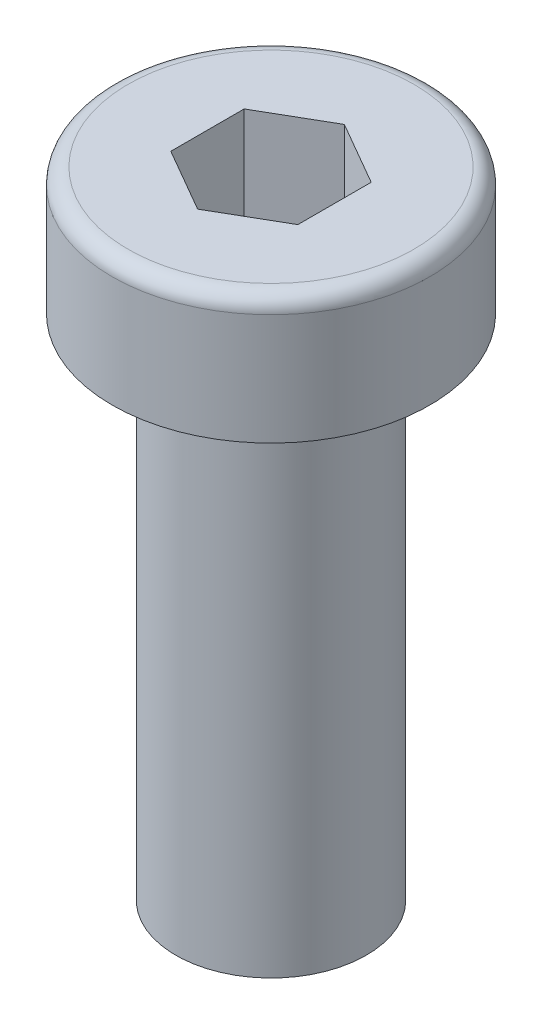
ISO-10303-21;
HEADER;
FILE_DESCRIPTION(('STEP AP214'),'2;1');
FILE_NAME('part.step','',(''),(''),'','','');
FILE_SCHEMA(('AUTOMOTIVE_DESIGN { 1 0 10303 214 1 1 1 1 }'));
ENDSEC;
DATA;
#1=APPLICATION_CONTEXT('core data for automotive mechanical design processes');
#2=APPLICATION_PROTOCOL_DEFINITION('international standard','automotive_design',2000,#1);
#3=PRODUCT_CONTEXT('',#1,'mechanical');
#4=PRODUCT('Part','Part','',(#3));
#5=PRODUCT_RELATED_PRODUCT_CATEGORY('part','',(#4));
#6=PRODUCT_DEFINITION_FORMATION('','',#4);
#7=PRODUCT_DEFINITION_CONTEXT('part definition',#1,'design');
#8=PRODUCT_DEFINITION('design','',#6,#7);
#9=PRODUCT_DEFINITION_SHAPE('','',#8);
#10=(LENGTH_UNIT() NAMED_UNIT(*) SI_UNIT(.MILLI.,.METRE.));
#11=(NAMED_UNIT(*) PLANE_ANGLE_UNIT() SI_UNIT($,.RADIAN.));
#12=(NAMED_UNIT(*) SI_UNIT($,.STERADIAN.) SOLID_ANGLE_UNIT());
#13=UNCERTAINTY_MEASURE_WITH_UNIT(LENGTH_MEASURE(1.E-05),#10,'distance_accuracy_value','');
#14=(GEOMETRIC_REPRESENTATION_CONTEXT(3) GLOBAL_UNCERTAINTY_ASSIGNED_CONTEXT((#13)) GLOBAL_UNIT_ASSIGNED_CONTEXT((#10,
#11,#12)) REPRESENTATION_CONTEXT('',''));
#15=CARTESIAN_POINT('',(0.,0.,0.));
#16=DIRECTION('',(0.,0.,1.));
#17=DIRECTION('',(1.,0.,0.));
#18=AXIS2_PLACEMENT_3D('',#15,#16,#17);
#19=CARTESIAN_POINT('',(0.,20.,0.));
#20=DIRECTION('',(0.,-1.,0.));
#21=DIRECTION('',(0.,0.,-1.));
#22=AXIS2_PLACEMENT_3D('',#19,#20,#21);
#23=PLANE('',#22);
#24=DIRECTION('',(-0.866025403784439,0.,0.5));
#25=VECTOR('',#24,1.);
#26=CARTESIAN_POINT('',(0.,20.,-2.3094010767585));
#27=LINE('',#26,#25);
#28=CARTESIAN_POINT('',(0.,20.,-2.3094010767585));
#29=VERTEX_POINT('',#28);
#30=CARTESIAN_POINT('',(-2.,20.,-1.15470053837925));
#31=VERTEX_POINT('',#30);
#32=EDGE_CURVE('E125',#29,#31,#27,.T.);
#33=ORIENTED_EDGE('',*,*,#32,.F.);
#34=DIRECTION('',(-0.866025403784439,0.,-0.5));
#35=VECTOR('',#34,1.);
#36=CARTESIAN_POINT('',(2.,20.,-1.15470053837925));
#37=LINE('',#36,#35);
#38=CARTESIAN_POINT('',(2.,20.,-1.15470053837925));
#39=VERTEX_POINT('',#38);
#40=EDGE_CURVE('E51',#39,#29,#37,.T.);
#41=ORIENTED_EDGE('',*,*,#40,.F.);
#42=DIRECTION('',(0.,0.,-1.));
#43=VECTOR('',#42,1.);
#44=CARTESIAN_POINT('',(2.,20.,1.15470053837925));
#45=LINE('',#44,#43);
#46=CARTESIAN_POINT('',(2.,20.,1.15470053837925));
#47=VERTEX_POINT('',#46);
#48=EDGE_CURVE('E134',#47,#39,#45,.T.);
#49=ORIENTED_EDGE('',*,*,#48,.F.);
#50=DIRECTION('',(0.866025403784439,0.,-0.5));
#51=VECTOR('',#50,1.);
#52=CARTESIAN_POINT('',(0.,20.,2.3094010767585));
#53=LINE('',#52,#51);
#54=CARTESIAN_POINT('',(0.,20.,2.3094010767585));
#55=VERTEX_POINT('',#54);
#56=EDGE_CURVE('E132',#55,#47,#53,.T.);
#57=ORIENTED_EDGE('',*,*,#56,.F.);
#58=DIRECTION('',(0.866025403784439,0.,0.5));
#59=VECTOR('',#58,1.);
#60=CARTESIAN_POINT('',(-2.,20.,1.15470053837925));
#61=LINE('',#60,#59);
#62=CARTESIAN_POINT('',(-2.,20.,1.15470053837925));
#63=VERTEX_POINT('',#62);
#64=EDGE_CURVE('E99',#63,#55,#61,.T.);
#65=ORIENTED_EDGE('',*,*,#64,.F.);
#66=DIRECTION('',(0.,0.,1.));
#67=VECTOR('',#66,1.);
#68=CARTESIAN_POINT('',(-2.,20.,-1.15470053837925));
#69=LINE('',#68,#67);
#70=EDGE_CURVE('E128',#31,#63,#69,.T.);
#71=ORIENTED_EDGE('',*,*,#70,.F.);
#72=EDGE_LOOP('',(#33,#41,#49,#57,#65,#71));
#73=FACE_BOUND('',#72,.T.);
#74=CARTESIAN_POINT('',(0.,20.,0.));
#75=DIRECTION('',(0.,-1.,0.));
#76=DIRECTION('',(0.,0.,-1.));
#77=AXIS2_PLACEMENT_3D('',#74,#75,#76);
#78=CIRCLE('',#77,4.5);
#79=CARTESIAN_POINT('',(0.,20.,-4.5));
#80=VERTEX_POINT('',#79);
#81=EDGE_CURVE('E11',#80,#80,#78,.T.);
#82=ORIENTED_EDGE('',*,*,#81,.F.);
#83=EDGE_LOOP('',(#82));
#84=FACE_BOUND('',#83,.T.);
#85=ADVANCED_FACE('F37',(#73,#84),#23,.F.);
#86=CARTESIAN_POINT('',(0.,19.5,0.));
#87=DIRECTION('',(0.,-1.,0.));
#88=DIRECTION('',(0.,0.,-1.));
#89=AXIS2_PLACEMENT_3D('',#86,#87,#88);
#90=TOROIDAL_SURFACE('',#89,4.5,0.499999999999998);
#91=CARTESIAN_POINT('',(0.,19.5,0.));
#92=DIRECTION('',(0.,-1.,0.));
#93=DIRECTION('',(0.,0.,-1.));
#94=AXIS2_PLACEMENT_3D('',#91,#92,#93);
#95=CIRCLE('',#94,5.);
#96=CARTESIAN_POINT('',(0.,19.5,-5.));
#97=VERTEX_POINT('',#96);
#98=EDGE_CURVE('E44',#97,#97,#95,.T.);
#99=ORIENTED_EDGE('',*,*,#98,.F.);
#100=EDGE_LOOP('',(#99));
#101=FACE_BOUND('',#100,.T.);
#102=ORIENTED_EDGE('',*,*,#81,.T.);
#103=EDGE_LOOP('',(#102));
#104=FACE_BOUND('',#103,.T.);
#105=ADVANCED_FACE('F156',(#101,#104),#90,.T.);
#106=CARTESIAN_POINT('',(0.,0.,0.));
#107=DIRECTION('',(0.,-1.,0.));
#108=DIRECTION('',(0.,0.,-1.));
#109=AXIS2_PLACEMENT_3D('',#106,#107,#108);
#110=CYLINDRICAL_SURFACE('',#109,5.);
#111=CARTESIAN_POINT('',(0.,16.,0.));
#112=DIRECTION('',(0.,-1.,0.));
#113=DIRECTION('',(0.,0.,-1.));
#114=AXIS2_PLACEMENT_3D('',#111,#112,#113);
#115=CIRCLE('',#114,5.);
#116=CARTESIAN_POINT('',(0.,16.,-5.));
#117=VERTEX_POINT('',#116);
#118=EDGE_CURVE('E149',#117,#117,#115,.T.);
#119=ORIENTED_EDGE('',*,*,#118,.F.);
#120=EDGE_LOOP('',(#119));
#121=FACE_BOUND('',#120,.T.);
#122=ORIENTED_EDGE('',*,*,#98,.T.);
#123=EDGE_LOOP('',(#122));
#124=FACE_BOUND('',#123,.T.);
#125=ADVANCED_FACE('F154',(#121,#124),#110,.T.);
#126=CARTESIAN_POINT('',(-5.,16.,0.));
#127=DIRECTION('',(0.,1.,0.));
#128=DIRECTION('',(0.,0.,1.));
#129=AXIS2_PLACEMENT_3D('',#126,#127,#128);
#130=PLANE('',#129);
#131=CARTESIAN_POINT('',(0.,16.,0.));
#132=DIRECTION('',(0.,-1.,0.));
#133=DIRECTION('',(0.,0.,-1.));
#134=AXIS2_PLACEMENT_3D('',#131,#132,#133);
#135=CIRCLE('',#134,3.);
#136=CARTESIAN_POINT('',(0.,16.,-3.));
#137=VERTEX_POINT('',#136);
#138=EDGE_CURVE('E146',#137,#137,#135,.T.);
#139=ORIENTED_EDGE('',*,*,#138,.F.);
#140=EDGE_LOOP('',(#139));
#141=FACE_BOUND('',#140,.T.);
#142=ORIENTED_EDGE('',*,*,#118,.T.);
#143=EDGE_LOOP('',(#142));
#144=FACE_BOUND('',#143,.T.);
#145=ADVANCED_FACE('F189',(#141,#144),#130,.F.);
#146=CARTESIAN_POINT('',(0.,0.,0.));
#147=DIRECTION('',(0.,-1.,0.));
#148=DIRECTION('',(0.,0.,-1.));
#149=AXIS2_PLACEMENT_3D('',#146,#147,#148);
#150=CYLINDRICAL_SURFACE('',#149,3.);
#151=CARTESIAN_POINT('',(0.,0.,0.));
#152=DIRECTION('',(0.,-1.,0.));
#153=DIRECTION('',(0.,0.,-1.));
#154=AXIS2_PLACEMENT_3D('',#151,#152,#153);
#155=CIRCLE('',#154,3.);
#156=CARTESIAN_POINT('',(0.,0.,-3.));
#157=VERTEX_POINT('',#156);
#158=EDGE_CURVE('E138',#157,#157,#155,.T.);
#159=ORIENTED_EDGE('',*,*,#158,.F.);
#160=EDGE_LOOP('',(#159));
#161=FACE_BOUND('',#160,.T.);
#162=ORIENTED_EDGE('',*,*,#138,.T.);
#163=EDGE_LOOP('',(#162));
#164=FACE_BOUND('',#163,.T.);
#165=ADVANCED_FACE('F181',(#161,#164),#150,.T.);
#166=CARTESIAN_POINT('',(-3.,0.,0.));
#167=DIRECTION('',(0.,1.,0.));
#168=DIRECTION('',(0.,0.,1.));
#169=AXIS2_PLACEMENT_3D('',#166,#167,#168);
#170=PLANE('',#169);
#171=ORIENTED_EDGE('',*,*,#158,.T.);
#172=EDGE_LOOP('',(#171));
#173=FACE_BOUND('',#172,.T.);
#174=ADVANCED_FACE('F175',(#173),#170,.F.);
#175=CARTESIAN_POINT('',(2.,17.,-1.15470053837925));
#176=DIRECTION('',(0.5,0.,-0.866025403784439));
#177=DIRECTION('',(-0.866025403784439,0.,-0.5));
#178=AXIS2_PLACEMENT_3D('',#175,#176,#177);
#179=PLANE('',#178);
#180=ORIENTED_EDGE('',*,*,#40,.T.);
#181=DIRECTION('',(0.,1.,0.));
#182=VECTOR('',#181,1.);
#183=CARTESIAN_POINT('',(0.,17.,-2.3094010767585));
#184=LINE('',#183,#182);
#185=CARTESIAN_POINT('',(0.,17.,-2.3094010767585));
#186=VERTEX_POINT('',#185);
#187=EDGE_CURVE('E81',#186,#29,#184,.T.);
#188=ORIENTED_EDGE('',*,*,#187,.F.);
#189=DIRECTION('',(-0.866025403784439,0.,-0.5));
#190=VECTOR('',#189,1.);
#191=CARTESIAN_POINT('',(2.,17.,-1.15470053837925));
#192=LINE('',#191,#190);
#193=CARTESIAN_POINT('',(2.,17.,-1.15470053837925));
#194=VERTEX_POINT('',#193);
#195=EDGE_CURVE('E136',#194,#186,#192,.T.);
#196=ORIENTED_EDGE('',*,*,#195,.F.);
#197=DIRECTION('',(0.,1.,0.));
#198=VECTOR('',#197,1.);
#199=CARTESIAN_POINT('',(2.,17.,-1.15470053837925));
#200=LINE('',#199,#198);
#201=EDGE_CURVE('E59',#194,#39,#200,.T.);
#202=ORIENTED_EDGE('',*,*,#201,.T.);
#203=EDGE_LOOP('',(#180,#188,#196,#202));
#204=FACE_BOUND('',#203,.T.);
#205=ADVANCED_FACE('F173',(#204),#179,.F.);
#206=CARTESIAN_POINT('',(2.,17.,1.15470053837925));
#207=DIRECTION('',(1.,0.,0.));
#208=DIRECTION('',(0.,0.,-1.));
#209=AXIS2_PLACEMENT_3D('',#206,#207,#208);
#210=PLANE('',#209);
#211=ORIENTED_EDGE('',*,*,#48,.T.);
#212=ORIENTED_EDGE('',*,*,#201,.F.);
#213=DIRECTION('',(0.,0.,-1.));
#214=VECTOR('',#213,1.);
#215=CARTESIAN_POINT('',(2.,17.,1.15470053837925));
#216=LINE('',#215,#214);
#217=CARTESIAN_POINT('',(2.,17.,1.15470053837925));
#218=VERTEX_POINT('',#217);
#219=EDGE_CURVE('E111',#218,#194,#216,.T.);
#220=ORIENTED_EDGE('',*,*,#219,.F.);
#221=DIRECTION('',(0.,1.,0.));
#222=VECTOR('',#221,1.);
#223=CARTESIAN_POINT('',(2.,17.,1.15470053837925));
#224=LINE('',#223,#222);
#225=EDGE_CURVE('E103',#218,#47,#224,.T.);
#226=ORIENTED_EDGE('',*,*,#225,.T.);
#227=EDGE_LOOP('',(#211,#212,#220,#226));
#228=FACE_BOUND('',#227,.T.);
#229=ADVANCED_FACE('F174',(#228),#210,.F.);
#230=CARTESIAN_POINT('',(0.,17.,2.3094010767585));
#231=DIRECTION('',(0.5,0.,0.866025403784439));
#232=DIRECTION('',(0.866025403784439,0.,-0.5));
#233=AXIS2_PLACEMENT_3D('',#230,#231,#232);
#234=PLANE('',#233);
#235=ORIENTED_EDGE('',*,*,#56,.T.);
#236=ORIENTED_EDGE('',*,*,#225,.F.);
#237=DIRECTION('',(0.866025403784439,0.,-0.5));
#238=VECTOR('',#237,1.);
#239=CARTESIAN_POINT('',(0.,17.,2.3094010767585));
#240=LINE('',#239,#238);
#241=CARTESIAN_POINT('',(0.,17.,2.3094010767585));
#242=VERTEX_POINT('',#241);
#243=EDGE_CURVE('E107',#242,#218,#240,.T.);
#244=ORIENTED_EDGE('',*,*,#243,.F.);
#245=DIRECTION('',(0.,1.,0.));
#246=VECTOR('',#245,1.);
#247=CARTESIAN_POINT('',(0.,17.,2.3094010767585));
#248=LINE('',#247,#246);
#249=EDGE_CURVE('E92',#242,#55,#248,.T.);
#250=ORIENTED_EDGE('',*,*,#249,.T.);
#251=EDGE_LOOP('',(#235,#236,#244,#250));
#252=FACE_BOUND('',#251,.T.);
#253=ADVANCED_FACE('F108',(#252),#234,.F.);
#254=CARTESIAN_POINT('',(-2.,17.,1.15470053837925));
#255=DIRECTION('',(-0.5,0.,0.866025403784438));
#256=DIRECTION('',(0.866025403784439,0.,0.5));
#257=AXIS2_PLACEMENT_3D('',#254,#255,#256);
#258=PLANE('',#257);
#259=ORIENTED_EDGE('',*,*,#64,.T.);
#260=ORIENTED_EDGE('',*,*,#249,.F.);
#261=DIRECTION('',(0.866025403784439,0.,0.5));
#262=VECTOR('',#261,1.);
#263=CARTESIAN_POINT('',(-2.,17.,1.15470053837925));
#264=LINE('',#263,#262);
#265=CARTESIAN_POINT('',(-2.,17.,1.15470053837925));
#266=VERTEX_POINT('',#265);
#267=EDGE_CURVE('E96',#266,#242,#264,.T.);
#268=ORIENTED_EDGE('',*,*,#267,.F.);
#269=DIRECTION('',(0.,1.,0.));
#270=VECTOR('',#269,1.);
#271=CARTESIAN_POINT('',(-2.,17.,1.15470053837925));
#272=LINE('',#271,#270);
#273=EDGE_CURVE('E104',#266,#63,#272,.T.);
#274=ORIENTED_EDGE('',*,*,#273,.T.);
#275=EDGE_LOOP('',(#259,#260,#268,#274));
#276=FACE_BOUND('',#275,.T.);
#277=ADVANCED_FACE('F94',(#276),#258,.F.);
#278=CARTESIAN_POINT('',(-2.,17.,-1.15470053837925));
#279=DIRECTION('',(-1.,0.,0.));
#280=DIRECTION('',(0.,0.,1.));
#281=AXIS2_PLACEMENT_3D('',#278,#279,#280);
#282=PLANE('',#281);
#283=ORIENTED_EDGE('',*,*,#70,.T.);
#284=ORIENTED_EDGE('',*,*,#273,.F.);
#285=DIRECTION('',(0.,0.,1.));
#286=VECTOR('',#285,1.);
#287=CARTESIAN_POINT('',(-2.,17.,-1.15470053837925));
#288=LINE('',#287,#286);
#289=CARTESIAN_POINT('',(-2.,17.,-1.15470053837925));
#290=VERTEX_POINT('',#289);
#291=EDGE_CURVE('E117',#290,#266,#288,.T.);
#292=ORIENTED_EDGE('',*,*,#291,.F.);
#293=DIRECTION('',(0.,1.,0.));
#294=VECTOR('',#293,1.);
#295=CARTESIAN_POINT('',(-2.,17.,-1.15470053837925));
#296=LINE('',#295,#294);
#297=EDGE_CURVE('E141',#290,#31,#296,.T.);
#298=ORIENTED_EDGE('',*,*,#297,.T.);
#299=EDGE_LOOP('',(#283,#284,#292,#298));
#300=FACE_BOUND('',#299,.T.);
#301=ADVANCED_FACE('F233',(#300),#282,.F.);
#302=CARTESIAN_POINT('',(0.,17.,-2.3094010767585));
#303=DIRECTION('',(-0.5,0.,-0.866025403784439));
#304=DIRECTION('',(-0.866025403784439,0.,0.5));
#305=AXIS2_PLACEMENT_3D('',#302,#303,#304);
#306=PLANE('',#305);
#307=ORIENTED_EDGE('',*,*,#32,.T.);
#308=ORIENTED_EDGE('',*,*,#297,.F.);
#309=DIRECTION('',(-0.866025403784439,0.,0.5));
#310=VECTOR('',#309,1.);
#311=CARTESIAN_POINT('',(0.,17.,-2.3094010767585));
#312=LINE('',#311,#310);
#313=EDGE_CURVE('E119',#186,#290,#312,.T.);
#314=ORIENTED_EDGE('',*,*,#313,.F.);
#315=ORIENTED_EDGE('',*,*,#187,.T.);
#316=EDGE_LOOP('',(#307,#308,#314,#315));
#317=FACE_BOUND('',#316,.T.);
#318=ADVANCED_FACE('F171',(#317),#306,.F.);
#319=CARTESIAN_POINT('',(0.,17.,0.));
#320=DIRECTION('',(0.,1.,0.));
#321=DIRECTION('',(0.,0.,1.));
#322=AXIS2_PLACEMENT_3D('',#319,#320,#321);
#323=PLANE('',#322);
#324=ORIENTED_EDGE('',*,*,#195,.T.);
#325=ORIENTED_EDGE('',*,*,#313,.T.);
#326=ORIENTED_EDGE('',*,*,#291,.T.);
#327=ORIENTED_EDGE('',*,*,#267,.T.);
#328=ORIENTED_EDGE('',*,*,#243,.T.);
#329=ORIENTED_EDGE('',*,*,#219,.T.);
#330=EDGE_LOOP('',(#324,#325,#326,#327,#328,#329));
#331=FACE_BOUND('',#330,.T.);
#332=ADVANCED_FACE('F114',(#331),#323,.T.);
#333=CLOSED_SHELL('',(#85,#105,#125,#145,#165,#174,#205,#229,#253,#277,#301,#318,#332));
#334=MANIFOLD_SOLID_BREP('B2',#333);
#335=ADVANCED_BREP_SHAPE_REPRESENTATION('',(#18,#334),#14);
#336=SHAPE_DEFINITION_REPRESENTATION(#9,#335);
ENDSEC;
END-ISO-10303-21;
